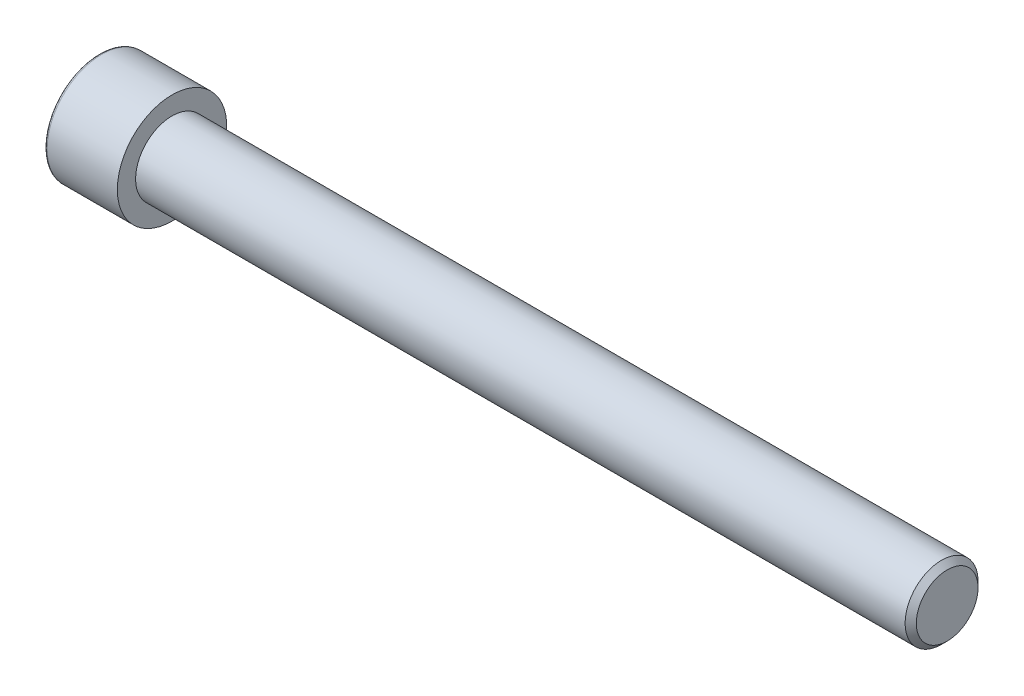
ISO-10303-21;
HEADER;
FILE_DESCRIPTION(('STEP AP214'),'2;1');
FILE_NAME('part.step','',(''),(''),'','','');
FILE_SCHEMA(('AUTOMOTIVE_DESIGN { 1 0 10303 214 1 1 1 1 }'));
ENDSEC;
DATA;
#1=APPLICATION_CONTEXT('core data for automotive mechanical design processes');
#2=APPLICATION_PROTOCOL_DEFINITION('international standard','automotive_design',2000,#1);
#3=PRODUCT_CONTEXT('',#1,'mechanical');
#4=PRODUCT('Part','Part','',(#3));
#5=PRODUCT_RELATED_PRODUCT_CATEGORY('part','',(#4));
#6=PRODUCT_DEFINITION_FORMATION('','',#4);
#7=PRODUCT_DEFINITION_CONTEXT('part definition',#1,'design');
#8=PRODUCT_DEFINITION('design','',#6,#7);
#9=PRODUCT_DEFINITION_SHAPE('','',#8);
#10=(LENGTH_UNIT() NAMED_UNIT(*) SI_UNIT(.MILLI.,.METRE.));
#11=(NAMED_UNIT(*) PLANE_ANGLE_UNIT() SI_UNIT($,.RADIAN.));
#12=(NAMED_UNIT(*) SI_UNIT($,.STERADIAN.) SOLID_ANGLE_UNIT());
#13=UNCERTAINTY_MEASURE_WITH_UNIT(LENGTH_MEASURE(1.E-05),#10,'distance_accuracy_value','');
#14=(GEOMETRIC_REPRESENTATION_CONTEXT(3) GLOBAL_UNCERTAINTY_ASSIGNED_CONTEXT((#13)) GLOBAL_UNIT_ASSIGNED_CONTEXT((#10,
#11,#12)) REPRESENTATION_CONTEXT('',''));
#15=CARTESIAN_POINT('',(0.,0.,0.));
#16=DIRECTION('',(0.,0.,1.));
#17=DIRECTION('',(1.,0.,0.));
#18=AXIS2_PLACEMENT_3D('',#15,#16,#17);
#19=CARTESIAN_POINT('',(0.,0.,0.));
#20=DIRECTION('',(1.,0.,0.));
#21=DIRECTION('',(0.,0.,-1.));
#22=AXIS2_PLACEMENT_3D('',#19,#20,#21);
#23=PLANE('',#22);
#24=DIRECTION('',(0.,-0.5,0.866025403784439));
#25=VECTOR('',#24,1.);
#26=CARTESIAN_POINT('',(0.,8.08290376865476,0.));
#27=LINE('',#26,#25);
#28=CARTESIAN_POINT('',(0.,8.08290376865476,0.));
#29=VERTEX_POINT('',#28);
#30=CARTESIAN_POINT('',(0.,4.04145188432738,7.));
#31=VERTEX_POINT('',#30);
#32=EDGE_CURVE('E100',#29,#31,#27,.T.);
#33=ORIENTED_EDGE('',*,*,#32,.T.);
#34=DIRECTION('',(0.,-1.,0.));
#35=VECTOR('',#34,1.);
#36=CARTESIAN_POINT('',(0.,4.04145188432738,7.));
#37=LINE('',#36,#35);
#38=CARTESIAN_POINT('',(0.,-4.04145188432738,7.));
#39=VERTEX_POINT('',#38);
#40=EDGE_CURVE('E107',#31,#39,#37,.T.);
#41=ORIENTED_EDGE('',*,*,#40,.T.);
#42=DIRECTION('',(0.,-0.5,-0.866025403784439));
#43=VECTOR('',#42,1.);
#44=CARTESIAN_POINT('',(0.,-4.04145188432738,7.));
#45=LINE('',#44,#43);
#46=CARTESIAN_POINT('',(0.,-8.08290376865476,0.));
#47=VERTEX_POINT('',#46);
#48=EDGE_CURVE('E113',#39,#47,#45,.T.);
#49=ORIENTED_EDGE('',*,*,#48,.T.);
#50=DIRECTION('',(0.,0.5,-0.866025403784439));
#51=VECTOR('',#50,1.);
#52=CARTESIAN_POINT('',(0.,-8.08290376865476,0.));
#53=LINE('',#52,#51);
#54=CARTESIAN_POINT('',(0.,-4.04145188432738,-7.));
#55=VERTEX_POINT('',#54);
#56=EDGE_CURVE('E122',#47,#55,#53,.T.);
#57=ORIENTED_EDGE('',*,*,#56,.T.);
#58=DIRECTION('',(0.,1.,0.));
#59=VECTOR('',#58,1.);
#60=CARTESIAN_POINT('',(0.,-4.04145188432738,-7.));
#61=LINE('',#60,#59);
#62=CARTESIAN_POINT('',(0.,4.04145188432738,-7.));
#63=VERTEX_POINT('',#62);
#64=EDGE_CURVE('E125',#55,#63,#61,.T.);
#65=ORIENTED_EDGE('',*,*,#64,.T.);
#66=DIRECTION('',(0.,0.5,0.866025403784439));
#67=VECTOR('',#66,1.);
#68=CARTESIAN_POINT('',(0.,4.04145188432738,-7.));
#69=LINE('',#68,#67);
#70=EDGE_CURVE('E118',#63,#29,#69,.T.);
#71=ORIENTED_EDGE('',*,*,#70,.T.);
#72=EDGE_LOOP('',(#33,#41,#49,#57,#65,#71));
#73=FACE_BOUND('',#72,.T.);
#74=CARTESIAN_POINT('',(0.,0.,0.));
#75=DIRECTION('',(-1.,0.,0.));
#76=DIRECTION('',(0.,0.,1.));
#77=AXIS2_PLACEMENT_3D('',#74,#75,#76);
#78=CIRCLE('',#77,11.4);
#79=CARTESIAN_POINT('',(0.,0.,11.4));
#80=VERTEX_POINT('',#79);
#81=EDGE_CURVE('E142',#80,#80,#78,.T.);
#82=ORIENTED_EDGE('',*,*,#81,.T.);
#83=EDGE_LOOP('',(#82));
#84=FACE_BOUND('',#83,.T.);
#85=ADVANCED_FACE('F39',(#73,#84),#23,.F.);
#86=CARTESIAN_POINT('',(16.,12.,0.));
#87=DIRECTION('',(-1.,0.,0.));
#88=DIRECTION('',(0.,0.,1.));
#89=AXIS2_PLACEMENT_3D('',#86,#87,#88);
#90=PLANE('',#89);
#91=CARTESIAN_POINT('',(16.,0.,0.));
#92=DIRECTION('',(-1.,0.,0.));
#93=DIRECTION('',(0.,0.,1.));
#94=AXIS2_PLACEMENT_3D('',#91,#92,#93);
#95=CIRCLE('',#94,12.);
#96=CARTESIAN_POINT('',(16.,0.,12.));
#97=VERTEX_POINT('',#96);
#98=EDGE_CURVE('E148',#97,#97,#95,.T.);
#99=ORIENTED_EDGE('',*,*,#98,.F.);
#100=EDGE_LOOP('',(#99));
#101=FACE_BOUND('',#100,.T.);
#102=CARTESIAN_POINT('',(16.,0.,0.));
#103=DIRECTION('',(-1.,0.,0.));
#104=DIRECTION('',(0.,0.,1.));
#105=AXIS2_PLACEMENT_3D('',#102,#103,#104);
#106=CIRCLE('',#105,8.);
#107=CARTESIAN_POINT('',(16.,0.,8.));
#108=VERTEX_POINT('',#107);
#109=EDGE_CURVE('E151',#108,#108,#106,.F.);
#110=ORIENTED_EDGE('',*,*,#109,.F.);
#111=EDGE_LOOP('',(#110));
#112=FACE_BOUND('',#111,.T.);
#113=ADVANCED_FACE('F210',(#101,#112),#90,.F.);
#114=CARTESIAN_POINT('',(16.,0.,0.));
#115=DIRECTION('',(-1.,0.,0.));
#116=DIRECTION('',(0.,0.,1.));
#117=AXIS2_PLACEMENT_3D('',#114,#115,#116);
#118=CYLINDRICAL_SURFACE('',#117,12.);
#119=CARTESIAN_POINT('',(0.6,0.,0.));
#120=DIRECTION('',(-1.,0.,0.));
#121=DIRECTION('',(0.,0.,1.));
#122=AXIS2_PLACEMENT_3D('',#119,#120,#121);
#123=CIRCLE('',#122,12.);
#124=CARTESIAN_POINT('',(0.6,0.,12.));
#125=VERTEX_POINT('',#124);
#126=EDGE_CURVE('E145',#125,#125,#123,.T.);
#127=ORIENTED_EDGE('',*,*,#126,.F.);
#128=EDGE_LOOP('',(#127));
#129=FACE_BOUND('',#128,.T.);
#130=ORIENTED_EDGE('',*,*,#98,.T.);
#131=EDGE_LOOP('',(#130));
#132=FACE_BOUND('',#131,.T.);
#133=ADVANCED_FACE('F214',(#129,#132),#118,.T.);
#134=CARTESIAN_POINT('',(0.600000000000005,0.,0.));
#135=DIRECTION('',(-1.,0.,0.));
#136=DIRECTION('',(0.,0.,1.));
#137=AXIS2_PLACEMENT_3D('',#134,#135,#136);
#138=TOROIDAL_SURFACE('',#137,11.4,0.600000000000009);
#139=ORIENTED_EDGE('',*,*,#126,.T.);
#140=EDGE_LOOP('',(#139));
#141=FACE_BOUND('',#140,.T.);
#142=ORIENTED_EDGE('',*,*,#81,.F.);
#143=EDGE_LOOP('',(#142));
#144=FACE_BOUND('',#143,.T.);
#145=ADVANCED_FACE('F220',(#141,#144),#138,.T.);
#146=CARTESIAN_POINT('',(186.,0.,0.));
#147=DIRECTION('',(-1.,0.,0.));
#148=DIRECTION('',(0.,0.,1.));
#149=AXIS2_PLACEMENT_3D('',#146,#147,#148);
#150=CYLINDRICAL_SURFACE('',#149,8.);
#151=ORIENTED_EDGE('',*,*,#109,.T.);
#152=EDGE_LOOP('',(#151));
#153=FACE_BOUND('',#152,.T.);
#154=CARTESIAN_POINT('',(184.773,0.,0.));
#155=DIRECTION('',(-1.,0.,0.));
#156=DIRECTION('',(0.,0.,1.));
#157=AXIS2_PLACEMENT_3D('',#154,#155,#156);
#158=CIRCLE('',#157,8.);
#159=CARTESIAN_POINT('',(184.773,0.,8.));
#160=VERTEX_POINT('',#159);
#161=EDGE_CURVE('E139',#160,#160,#158,.T.);
#162=ORIENTED_EDGE('',*,*,#161,.T.);
#163=EDGE_LOOP('',(#162));
#164=FACE_BOUND('',#163,.T.);
#165=ADVANCED_FACE('F227',(#153,#164),#150,.T.);
#166=CARTESIAN_POINT('',(186.,0.,0.));
#167=DIRECTION('',(-1.,0.,0.));
#168=DIRECTION('',(0.,0.,1.));
#169=AXIS2_PLACEMENT_3D('',#166,#167,#168);
#170=CONICAL_SURFACE('',#169,6.773,0.785398163397446);
#171=ORIENTED_EDGE('',*,*,#161,.F.);
#172=EDGE_LOOP('',(#171));
#173=FACE_BOUND('',#172,.T.);
#174=CARTESIAN_POINT('',(186.,0.,0.));
#175=DIRECTION('',(-1.,0.,0.));
#176=DIRECTION('',(0.,0.,1.));
#177=AXIS2_PLACEMENT_3D('',#174,#175,#176);
#178=CIRCLE('',#177,6.773);
#179=CARTESIAN_POINT('',(186.,0.,6.773));
#180=VERTEX_POINT('',#179);
#181=EDGE_CURVE('E103',#180,#180,#178,.T.);
#182=ORIENTED_EDGE('',*,*,#181,.T.);
#183=EDGE_LOOP('',(#182));
#184=FACE_BOUND('',#183,.T.);
#185=ADVANCED_FACE('F207',(#173,#184),#170,.T.);
#186=CARTESIAN_POINT('',(186.,6.773,0.));
#187=DIRECTION('',(-1.,0.,0.));
#188=DIRECTION('',(0.,0.,1.));
#189=AXIS2_PLACEMENT_3D('',#186,#187,#188);
#190=PLANE('',#189);
#191=ORIENTED_EDGE('',*,*,#181,.F.);
#192=EDGE_LOOP('',(#191));
#193=FACE_BOUND('',#192,.T.);
#194=ADVANCED_FACE('F203',(#193),#190,.F.);
#195=CARTESIAN_POINT('',(12.,8.08290376865476,0.));
#196=DIRECTION('',(0.,-0.866025403784439,-0.5));
#197=DIRECTION('',(0.,0.5,-0.866025403784439));
#198=AXIS2_PLACEMENT_3D('',#195,#196,#197);
#199=PLANE('',#198);
#200=DIRECTION('',(-1.,0.,0.));
#201=VECTOR('',#200,1.);
#202=CARTESIAN_POINT('',(12.,8.08290376865476,0.));
#203=LINE('',#202,#201);
#204=CARTESIAN_POINT('',(8.24081062144515,8.08290376865476,0.));
#205=VERTEX_POINT('',#204);
#206=EDGE_CURVE('E128',#205,#29,#203,.T.);
#207=ORIENTED_EDGE('',*,*,#206,.F.);
#208=CARTESIAN_POINT('',(8.24074395334994,8.0830192387086,-0.000200000000000299));
#209=CARTESIAN_POINT('',(8.29202555673095,7.99418356332252,0.153667903293391));
#210=CARTESIAN_POINT('',(8.34097980978085,7.90501666556988,0.30810950055425));
#211=CARTESIAN_POINT('',(8.4335926165143,7.72595873929905,0.618246926353254));
#212=CARTESIAN_POINT('',(8.47724888570507,7.63606741609896,0.773943265295415));
#213=CARTESIAN_POINT('',(8.59941381160494,7.36495417725225,1.24352516958246));
#214=CARTESIAN_POINT('',(8.66889984688949,7.18266208641081,1.5592643327378));
#215=CARTESIAN_POINT('',(8.75038044738534,6.9098652897096,2.03176224476633));
#216=CARTESIAN_POINT('',(8.77359191890296,6.82017566928259,2.18710922425749));
#217=CARTESIAN_POINT('',(8.81251418935198,6.64039116946081,2.49850511236216));
#218=CARTESIAN_POINT('',(8.82822565100491,6.55029632658303,2.65455395772641));
#219=CARTESIAN_POINT('',(8.85174749050138,6.36995016641051,2.96692267009517));
#220=CARTESIAN_POINT('',(8.85956683512157,6.27969914366237,3.12324202693001));
#221=CARTESIAN_POINT('',(8.86714516201213,6.09911871281642,3.43601650800788));
#222=CARTESIAN_POINT('',(8.86690439329045,6.00878930722637,3.59247162790734));
#223=CARTESIAN_POINT('',(8.85516567196884,5.76131663355911,4.02110687218394));
#224=CARTESIAN_POINT('',(8.83545966104152,5.60425437562033,4.2931466828854));
#225=CARTESIAN_POINT('',(8.77297194365867,5.29117305327856,4.8354194400822));
#226=CARTESIAN_POINT('',(8.73016887967145,5.13515508991674,5.10565047951828));
#227=CARTESIAN_POINT('',(8.62317372407408,4.82144370220969,5.64901454193984));
#228=CARTESIAN_POINT('',(8.55852830921477,4.66378986193159,5.92207900330984));
#229=CARTESIAN_POINT('',(8.4118093319374,4.35083323311213,6.46413578499063));
#230=CARTESIAN_POINT('',(8.32977023275887,4.19552643669177,6.73313504715144));
#231=CARTESIAN_POINT('',(8.24074395334994,4.04133641427354,7.0002));
#232=B_SPLINE_CURVE_WITH_KNOTS('',3,(#208,#209,#210,#211,#212,#213,#214,#215,#216,#217,#218,
#219,#220,#221,#222,#223,#224,#225,#226,#227,#228,#229,#230,#231),.UNSPECIFIED.,.F.,.F.,(4,2,2,
2,2,2,2,2,2,2,2,4),(0.,0.554727910214695,1.10969417576209,2.2219327402719,2.76443041023617,
3.30688013473357,3.8487128486711,4.39052882332379,5.33376515141419,6.27787517570456,
7.2429241888324,8.20607866430097),.UNSPECIFIED.);
#233=CARTESIAN_POINT('',(8.24081062144515,4.04145188432738,7.));
#234=VERTEX_POINT('',#233);
#235=EDGE_CURVE('E11',#205,#234,#232,.T.);
#236=ORIENTED_EDGE('',*,*,#235,.T.);
#237=DIRECTION('',(-1.,0.,0.));
#238=VECTOR('',#237,1.);
#239=CARTESIAN_POINT('',(12.,4.04145188432738,7.));
#240=LINE('',#239,#238);
#241=EDGE_CURVE('E95',#234,#31,#240,.T.);
#242=ORIENTED_EDGE('',*,*,#241,.T.);
#243=ORIENTED_EDGE('',*,*,#32,.F.);
#244=EDGE_LOOP('',(#207,#236,#242,#243));
#245=FACE_BOUND('',#244,.T.);
#246=ADVANCED_FACE('F98',(#245),#199,.T.);
#247=CARTESIAN_POINT('',(12.,4.04145188432738,7.));
#248=DIRECTION('',(0.,0.,-1.));
#249=DIRECTION('',(-1.,0.,0.));
#250=AXIS2_PLACEMENT_3D('',#247,#248,#249);
#251=PLANE('',#250);
#252=ORIENTED_EDGE('',*,*,#241,.F.);
#253=CARTESIAN_POINT('',(5.57587941292219,-10.5951395559688,7.));
#254=CARTESIAN_POINT('',(5.72215788472476,-10.2913873854027,7.));
#255=CARTESIAN_POINT('',(5.86695568880045,-9.98690898111586,7.));
#256=CARTESIAN_POINT('',(6.15275105757623,-9.37611217415566,7.));
#257=CARTESIAN_POINT('',(6.29374796487649,-9.06979346424692,7.));
#258=CARTESIAN_POINT('',(6.57186848515588,-8.45322208251383,7.));
#259=CARTESIAN_POINT('',(6.70896439043919,-8.14295686634533,7.));
#260=CARTESIAN_POINT('',(6.97718199770579,-7.51986421385499,7.));
#261=CARTESIAN_POINT('',(7.10830400201994,-7.20703690814435,7.));
#262=CARTESIAN_POINT('',(7.36656028504088,-6.5695005443991,7.));
#263=CARTESIAN_POINT('',(7.49348005127018,-6.24470408202464,7.));
#264=CARTESIAN_POINT('',(7.73706702336103,-5.59121778689269,7.));
#265=CARTESIAN_POINT('',(7.85373304467385,-5.26252750927219,7.));
#266=CARTESIAN_POINT('',(8.07355811047227,-4.60143032919695,7.));
#267=CARTESIAN_POINT('',(8.17674688296708,-4.2690334243111,7.));
#268=CARTESIAN_POINT('',(8.36613945739777,-3.59949554460914,7.));
#269=CARTESIAN_POINT('',(8.45234888881718,-3.2623561820045,7.));
#270=CARTESIAN_POINT('',(8.60305564581958,-2.58479315996282,7.));
#271=CARTESIAN_POINT('',(8.66765350449936,-2.24439250484352,7.));
#272=CARTESIAN_POINT('',(8.74539831642546,-1.73091216973467,7.));
#273=CARTESIAN_POINT('',(8.7681223476882,-1.55925781299778,7.));
#274=CARTESIAN_POINT('',(8.80673620890492,-1.21518758086266,7.));
#275=CARTESIAN_POINT('',(8.82262668929935,-1.04277177952026,7.));
#276=CARTESIAN_POINT('',(8.84707027467927,-0.699545376197852,7.));
#277=CARTESIAN_POINT('',(8.85571101390069,-0.528741034985779,7.));
#278=CARTESIAN_POINT('',(8.86578587656476,-0.1869208499621,7.));
#279=CARTESIAN_POINT('',(8.86722011156257,-0.0159050094654492,7.));
#280=CARTESIAN_POINT('',(8.86284767868586,0.326038893609979,7.));
#281=CARTESIAN_POINT('',(8.85704082162707,0.496966953778641,7.));
#282=CARTESIAN_POINT('',(8.8383221933219,0.838436119348584,7.));
#283=CARTESIAN_POINT('',(8.82541002346138,1.00897720250108,7.));
#284=CARTESIAN_POINT('',(8.78532318764043,1.42691016284093,7.));
#285=CARTESIAN_POINT('',(8.75433158385114,1.67394276264429,7.));
#286=CARTESIAN_POINT('',(8.67919370737725,2.1659883041221,7.));
#287=CARTESIAN_POINT('',(8.63504542432949,2.41100093125723,7.));
#288=CARTESIAN_POINT('',(8.48522311454851,3.14282333035987,7.));
#289=CARTESIAN_POINT('',(8.36220388516809,3.62611875071593,7.));
#290=CARTESIAN_POINT('',(8.15116787960062,4.3487805325071,7.));
#291=CARTESIAN_POINT('',(8.07542139419739,4.59194251167669,7.));
#292=CARTESIAN_POINT('',(7.9166482621531,5.07590132488677,7.));
#293=CARTESIAN_POINT('',(7.83362156396132,5.31669814216627,7.));
#294=CARTESIAN_POINT('',(7.66157133885048,5.79601723780591,7.));
#295=CARTESIAN_POINT('',(7.5725500954382,6.03454034320772,7.));
#296=CARTESIAN_POINT('',(7.3894995127239,6.50964710521445,7.));
#297=CARTESIAN_POINT('',(7.29547025517154,6.74623079340525,7.));
#298=CARTESIAN_POINT('',(7.05091022334063,7.34607004782587,7.));
#299=CARTESIAN_POINT('',(6.89749500530549,7.70814802994476,7.));
#300=CARTESIAN_POINT('',(6.58311405374231,8.42902142446664,7.));
#301=CARTESIAN_POINT('',(6.4221477486436,8.78781658591592,7.));
#302=CARTESIAN_POINT('',(6.09434206590049,9.5028229612945,7.));
#303=CARTESIAN_POINT('',(5.92750112189063,9.85903345506375,7.));
#304=CARTESIAN_POINT('',(5.58925640841321,10.5692634953458,7.));
#305=CARTESIAN_POINT('',(5.41785276367774,10.9232831014262,7.));
#306=CARTESIAN_POINT('',(5.07120500870259,11.6299725078319,7.));
#307=CARTESIAN_POINT('',(4.8959564472764,11.982640120912,7.));
#308=CARTESIAN_POINT('',(4.54252537077448,12.6865021421779,7.));
#309=CARTESIAN_POINT('',(4.3643428393958,13.0376965421641,7.));
#310=CARTESIAN_POINT('',(3.82629497051468,14.0893490285881,7.));
#311=CARTESIAN_POINT('',(3.46287434288011,14.7879876175435,7.));
#312=CARTESIAN_POINT('',(2.76400520764348,16.1163630798682,7.));
#313=CARTESIAN_POINT('',(2.42913665633273,16.7464064050781,7.));
#314=CARTESIAN_POINT('',(1.75544455886196,18.0044087683408,7.));
#315=CARTESIAN_POINT('',(1.4166208425721,18.6323677152318,7.));
#316=CARTESIAN_POINT('',(0.736900591610472,19.8850342571872,7.));
#317=CARTESIAN_POINT('',(0.396011800685717,20.5097460603558,7.));
#318=CARTESIAN_POINT('',(-0.288064689435112,21.7578620874728,7.));
#319=CARTESIAN_POINT('',(-0.631252251240716,22.3812663866935,7.));
#320=CARTESIAN_POINT('',(-0.975285006989568,23.0042010690845,7.));
#321=B_SPLINE_CURVE_WITH_KNOTS('',3,(#253,#254,#255,#256,#257,#258,#259,#260,#261,#262,#263,
#264,#265,#266,#267,#268,#269,#270,#271,#272,#273,#274,#275,#276,#277,#278,#279,#280,#281,#282,
#283,#284,#285,#286,#287,#288,#289,#290,#291,#292,#293,#294,#295,#296,#297,#298,#299,#300,#301,
#302,#303,#304,#305,#306,#307,#308,#309,#310,#311,#312,#313,#314,#315,#316,#317,#318,#319,#320),
.UNSPECIFIED.,.F.,.F.,(4,2,2,2,2,2,2,2,2,2,2,2,2,2,2,2,2,2,2,2,2,2,2,2,2,2,2,2,2,2,2,2,2,4),(0.,
1.01143101724814,2.02303586270392,3.04059952013218,4.0581116227373,5.10411913857804,
6.15024733449321,7.19402754905384,8.23746111460828,9.27597104351024,9.79531214242649,
10.3146037977555,10.8275239688931,11.3404362001106,11.8533618322016,12.3663162427945,
13.1127965817182,13.8593910426537,15.3534778065278,16.1174816538324,16.8814909114363,
17.6452107630153,18.4089181516302,19.5885110371782,20.7681933551521,21.9481926318707,
23.1281596836154,24.3095735159024,25.4909939150696,27.8534625107793,29.9939673638473,
32.1345646316569,34.269560689375,36.4044302636885),.UNSPECIFIED.);
#322=CARTESIAN_POINT('',(8.24081062144515,-4.04145188432738,7.));
#323=VERTEX_POINT('',#322);
#324=EDGE_CURVE('E51',#234,#323,#321,.F.);
#325=ORIENTED_EDGE('',*,*,#324,.T.);
#326=DIRECTION('',(-1.,0.,0.));
#327=VECTOR('',#326,1.);
#328=CARTESIAN_POINT('',(12.,-4.04145188432738,7.));
#329=LINE('',#328,#327);
#330=EDGE_CURVE('E104',#323,#39,#329,.T.);
#331=ORIENTED_EDGE('',*,*,#330,.T.);
#332=ORIENTED_EDGE('',*,*,#40,.F.);
#333=EDGE_LOOP('',(#252,#325,#331,#332));
#334=FACE_BOUND('',#333,.T.);
#335=ADVANCED_FACE('F108',(#334),#251,.T.);
#336=CARTESIAN_POINT('',(12.,-4.04145188432738,7.));
#337=DIRECTION('',(0.,0.866025403784439,-0.5));
#338=DIRECTION('',(0.,0.5,0.866025403784439));
#339=AXIS2_PLACEMENT_3D('',#336,#337,#338);
#340=PLANE('',#339);
#341=ORIENTED_EDGE('',*,*,#330,.F.);
#342=CARTESIAN_POINT('',(8.24074395334994,-4.04133641427354,7.0002));
#343=CARTESIAN_POINT('',(8.29202555673095,-4.13017208965963,6.84633209670661));
#344=CARTESIAN_POINT('',(8.34097980978085,-4.21933898741226,6.69189049944575));
#345=CARTESIAN_POINT('',(8.4335926165143,-4.39839691368309,6.38175307364674));
#346=CARTESIAN_POINT('',(8.47724888570507,-4.48828823688319,6.22605673470458));
#347=CARTESIAN_POINT('',(8.59941381160494,-4.75940147572989,5.75647483041753));
#348=CARTESIAN_POINT('',(8.66889984688949,-4.94169356657133,5.4407356672622));
#349=CARTESIAN_POINT('',(8.75038044738534,-5.21449036327254,4.96823775523367));
#350=CARTESIAN_POINT('',(8.77359191890296,-5.30417998369956,4.81289077574251));
#351=CARTESIAN_POINT('',(8.81251418935198,-5.48396448352133,4.50149488763783));
#352=CARTESIAN_POINT('',(8.82822565100491,-5.57405932639911,4.34544604227359));
#353=CARTESIAN_POINT('',(8.85174749050138,-5.75440548657163,4.03307732990482));
#354=CARTESIAN_POINT('',(8.85956683512157,-5.84465650931978,3.87675797306999));
#355=CARTESIAN_POINT('',(8.86714516201213,-6.02523694016573,3.56398349199212));
#356=CARTESIAN_POINT('',(8.86690439329045,-6.11556634575578,3.40752837209266));
#357=CARTESIAN_POINT('',(8.85516567196884,-6.36303901942303,2.97889312781606));
#358=CARTESIAN_POINT('',(8.83545966104152,-6.52010127736182,2.7068533171146));
#359=CARTESIAN_POINT('',(8.77297194365867,-6.83318259970359,2.1645805599178));
#360=CARTESIAN_POINT('',(8.73016887967145,-6.9892005630654,1.89434952048172));
#361=CARTESIAN_POINT('',(8.62317372407408,-7.30291195077246,1.35098545806016));
#362=CARTESIAN_POINT('',(8.55852830921477,-7.46056579105055,1.07792099669016));
#363=CARTESIAN_POINT('',(8.4118093319374,-7.77352241987001,0.53586421500937));
#364=CARTESIAN_POINT('',(8.32977023275887,-7.92882921629037,0.266864952848559));
#365=CARTESIAN_POINT('',(8.24074395334994,-8.0830192387086,-0.000200000000000452));
#366=B_SPLINE_CURVE_WITH_KNOTS('',3,(#342,#343,#344,#345,#346,#347,#348,#349,#350,#351,#352,
#353,#354,#355,#356,#357,#358,#359,#360,#361,#362,#363,#364,#365),.UNSPECIFIED.,.F.,.F.,(4,2,2,
2,2,2,2,2,2,2,2,4),(0.,0.554727910214695,1.10969417576209,2.2219327402719,2.76443041023617,
3.30688013473358,3.8487128486711,4.39052882332379,5.33376515141419,6.27787517570456,
7.2429241888324,8.20607866430097),.UNSPECIFIED.);
#367=CARTESIAN_POINT('',(8.24081062144515,-8.08290376865476,0.));
#368=VERTEX_POINT('',#367);
#369=EDGE_CURVE('E61',#323,#368,#366,.T.);
#370=ORIENTED_EDGE('',*,*,#369,.T.);
#371=DIRECTION('',(-1.,0.,0.));
#372=VECTOR('',#371,1.);
#373=CARTESIAN_POINT('',(12.,-8.08290376865476,0.));
#374=LINE('',#373,#372);
#375=EDGE_CURVE('E134',#368,#47,#374,.T.);
#376=ORIENTED_EDGE('',*,*,#375,.T.);
#377=ORIENTED_EDGE('',*,*,#48,.F.);
#378=EDGE_LOOP('',(#341,#370,#376,#377));
#379=FACE_BOUND('',#378,.T.);
#380=ADVANCED_FACE('F183',(#379),#340,.T.);
#381=CARTESIAN_POINT('',(12.,-8.08290376865476,0.));
#382=DIRECTION('',(0.,0.866025403784439,0.5));
#383=DIRECTION('',(0.,-0.5,0.866025403784439));
#384=AXIS2_PLACEMENT_3D('',#381,#382,#383);
#385=PLANE('',#384);
#386=ORIENTED_EDGE('',*,*,#375,.F.);
#387=CARTESIAN_POINT('',(8.24074395334994,-8.0830192387086,0.000200000000000299));
#388=CARTESIAN_POINT('',(8.29202555673095,-7.99418356332252,-0.153667903293391));
#389=CARTESIAN_POINT('',(8.34097980978085,-7.90501666556988,-0.30810950055425));
#390=CARTESIAN_POINT('',(8.4335926165143,-7.72595873929905,-0.618246926353254));
#391=CARTESIAN_POINT('',(8.47724888570507,-7.63606741609896,-0.773943265295415));
#392=CARTESIAN_POINT('',(8.59941381160494,-7.36495417725225,-1.24352516958246));
#393=CARTESIAN_POINT('',(8.66889984688949,-7.18266208641081,-1.5592643327378));
#394=CARTESIAN_POINT('',(8.75038044738534,-6.9098652897096,-2.03176224476633));
#395=CARTESIAN_POINT('',(8.77359191890296,-6.82017566928259,-2.18710922425749));
#396=CARTESIAN_POINT('',(8.81251418935198,-6.64039116946081,-2.49850511236216));
#397=CARTESIAN_POINT('',(8.82822565100491,-6.55029632658303,-2.65455395772641));
#398=CARTESIAN_POINT('',(8.85174749050138,-6.36995016641051,-2.96692267009517));
#399=CARTESIAN_POINT('',(8.85956683512157,-6.27969914366237,-3.12324202693001));
#400=CARTESIAN_POINT('',(8.86714516201213,-6.09911871281642,-3.43601650800788));
#401=CARTESIAN_POINT('',(8.86690439329045,-6.00878930722637,-3.59247162790734));
#402=CARTESIAN_POINT('',(8.85516567196884,-5.76131663355911,-4.02110687218394));
#403=CARTESIAN_POINT('',(8.83545966104152,-5.60425437562033,-4.2931466828854));
#404=CARTESIAN_POINT('',(8.77297194365867,-5.29117305327856,-4.8354194400822));
#405=CARTESIAN_POINT('',(8.73016887967145,-5.13515508991674,-5.10565047951828));
#406=CARTESIAN_POINT('',(8.62317372407408,-4.82144370220969,-5.64901454193984));
#407=CARTESIAN_POINT('',(8.55852830921477,-4.66378986193159,-5.92207900330984));
#408=CARTESIAN_POINT('',(8.4118093319374,-4.35083323311213,-6.46413578499063));
#409=CARTESIAN_POINT('',(8.32977023275887,-4.19552643669177,-6.73313504715144));
#410=CARTESIAN_POINT('',(8.24074395334994,-4.04133641427354,-7.0002));
#411=B_SPLINE_CURVE_WITH_KNOTS('',3,(#387,#388,#389,#390,#391,#392,#393,#394,#395,#396,#397,
#398,#399,#400,#401,#402,#403,#404,#405,#406,#407,#408,#409,#410),.UNSPECIFIED.,.F.,.F.,(4,2,2,
2,2,2,2,2,2,2,2,4),(0.,0.554727910214695,1.10969417576209,2.2219327402719,2.76443041023617,
3.30688013473357,3.8487128486711,4.39052882332379,5.33376515141419,6.27787517570456,
7.2429241888324,8.20607866430097),.UNSPECIFIED.);
#412=CARTESIAN_POINT('',(8.24081062144515,-4.04145188432738,-7.));
#413=VERTEX_POINT('',#412);
#414=EDGE_CURVE('E187',#368,#413,#411,.T.);
#415=ORIENTED_EDGE('',*,*,#414,.T.);
#416=DIRECTION('',(-1.,0.,0.));
#417=VECTOR('',#416,1.);
#418=CARTESIAN_POINT('',(12.,-4.04145188432738,-7.));
#419=LINE('',#418,#417);
#420=EDGE_CURVE('E132',#413,#55,#419,.T.);
#421=ORIENTED_EDGE('',*,*,#420,.T.);
#422=ORIENTED_EDGE('',*,*,#56,.F.);
#423=EDGE_LOOP('',(#386,#415,#421,#422));
#424=FACE_BOUND('',#423,.T.);
#425=ADVANCED_FACE('F178',(#424),#385,.T.);
#426=CARTESIAN_POINT('',(12.,-4.04145188432738,-7.));
#427=DIRECTION('',(0.,0.,1.));
#428=DIRECTION('',(1.,0.,0.));
#429=AXIS2_PLACEMENT_3D('',#426,#427,#428);
#430=PLANE('',#429);
#431=ORIENTED_EDGE('',*,*,#420,.F.);
#432=CARTESIAN_POINT('',(5.57587941292219,-10.5951395559688,-7.));
#433=CARTESIAN_POINT('',(5.72215788472476,-10.2913873854027,-7.));
#434=CARTESIAN_POINT('',(5.86695568880045,-9.98690898111586,-7.));
#435=CARTESIAN_POINT('',(6.15275105757623,-9.37611217415566,-7.));
#436=CARTESIAN_POINT('',(6.29374796487649,-9.06979346424692,-7.));
#437=CARTESIAN_POINT('',(6.57186848515588,-8.45322208251383,-7.));
#438=CARTESIAN_POINT('',(6.70896439043919,-8.14295686634533,-7.));
#439=CARTESIAN_POINT('',(6.97718199770579,-7.51986421385499,-7.));
#440=CARTESIAN_POINT('',(7.10830400201994,-7.20703690814435,-7.));
#441=CARTESIAN_POINT('',(7.36656028504088,-6.5695005443991,-7.));
#442=CARTESIAN_POINT('',(7.49348005127018,-6.24470408202464,-7.));
#443=CARTESIAN_POINT('',(7.73706702336103,-5.59121778689269,-7.));
#444=CARTESIAN_POINT('',(7.85373304467385,-5.26252750927219,-7.));
#445=CARTESIAN_POINT('',(8.07355811047227,-4.60143032919695,-7.));
#446=CARTESIAN_POINT('',(8.17674688296708,-4.2690334243111,-7.));
#447=CARTESIAN_POINT('',(8.36613945739777,-3.59949554460914,-7.));
#448=CARTESIAN_POINT('',(8.45234888881718,-3.2623561820045,-7.));
#449=CARTESIAN_POINT('',(8.60305564581958,-2.58479315996282,-7.));
#450=CARTESIAN_POINT('',(8.66765350449936,-2.24439250484352,-7.));
#451=CARTESIAN_POINT('',(8.74539831642546,-1.73091216973467,-7.));
#452=CARTESIAN_POINT('',(8.7681223476882,-1.55925781299778,-7.));
#453=CARTESIAN_POINT('',(8.80673620890492,-1.21518758086266,-7.));
#454=CARTESIAN_POINT('',(8.82262668929935,-1.04277177952026,-7.));
#455=CARTESIAN_POINT('',(8.84707027467927,-0.699545376197852,-7.));
#456=CARTESIAN_POINT('',(8.85571101390069,-0.528741034985779,-7.));
#457=CARTESIAN_POINT('',(8.86578587656476,-0.1869208499621,-7.));
#458=CARTESIAN_POINT('',(8.86722011156257,-0.0159050094654492,-7.));
#459=CARTESIAN_POINT('',(8.86284767868586,0.326038893609979,-7.));
#460=CARTESIAN_POINT('',(8.85704082162707,0.496966953778641,-7.));
#461=CARTESIAN_POINT('',(8.8383221933219,0.838436119348584,-7.));
#462=CARTESIAN_POINT('',(8.82541002346138,1.00897720250108,-7.));
#463=CARTESIAN_POINT('',(8.78532318764043,1.42691016284093,-7.));
#464=CARTESIAN_POINT('',(8.75433158385114,1.67394276264429,-7.));
#465=CARTESIAN_POINT('',(8.67919370737725,2.1659883041221,-7.));
#466=CARTESIAN_POINT('',(8.63504542432949,2.41100093125723,-7.));
#467=CARTESIAN_POINT('',(8.48522311454851,3.14282333035987,-7.));
#468=CARTESIAN_POINT('',(8.36220388516809,3.62611875071593,-7.));
#469=CARTESIAN_POINT('',(8.15116787960062,4.3487805325071,-7.));
#470=CARTESIAN_POINT('',(8.07542139419739,4.59194251167669,-7.));
#471=CARTESIAN_POINT('',(7.9166482621531,5.07590132488677,-7.));
#472=CARTESIAN_POINT('',(7.83362156396132,5.31669814216627,-7.));
#473=CARTESIAN_POINT('',(7.66157133885048,5.79601723780591,-7.));
#474=CARTESIAN_POINT('',(7.5725500954382,6.03454034320772,-7.));
#475=CARTESIAN_POINT('',(7.3894995127239,6.50964710521445,-7.));
#476=CARTESIAN_POINT('',(7.29547025517154,6.74623079340525,-7.));
#477=CARTESIAN_POINT('',(7.05091022334063,7.34607004782587,-7.));
#478=CARTESIAN_POINT('',(6.89749500530549,7.70814802994476,-7.));
#479=CARTESIAN_POINT('',(6.58311405374231,8.42902142446664,-7.));
#480=CARTESIAN_POINT('',(6.4221477486436,8.78781658591592,-7.));
#481=CARTESIAN_POINT('',(6.09434206590049,9.5028229612945,-7.));
#482=CARTESIAN_POINT('',(5.92750112189063,9.85903345506375,-7.));
#483=CARTESIAN_POINT('',(5.58925640841321,10.5692634953458,-7.));
#484=CARTESIAN_POINT('',(5.41785276367774,10.9232831014262,-7.));
#485=CARTESIAN_POINT('',(5.07120500870259,11.6299725078319,-7.));
#486=CARTESIAN_POINT('',(4.8959564472764,11.982640120912,-7.));
#487=CARTESIAN_POINT('',(4.54252537077448,12.6865021421779,-7.));
#488=CARTESIAN_POINT('',(4.3643428393958,13.0376965421641,-7.));
#489=CARTESIAN_POINT('',(3.82629497051468,14.0893490285881,-7.));
#490=CARTESIAN_POINT('',(3.46287434288011,14.7879876175435,-7.));
#491=CARTESIAN_POINT('',(2.76400520764348,16.1163630798682,-7.));
#492=CARTESIAN_POINT('',(2.42913665633273,16.7464064050781,-7.));
#493=CARTESIAN_POINT('',(1.75544455886196,18.0044087683408,-7.));
#494=CARTESIAN_POINT('',(1.4166208425721,18.6323677152318,-7.));
#495=CARTESIAN_POINT('',(0.736900591610472,19.8850342571872,-7.));
#496=CARTESIAN_POINT('',(0.396011800685717,20.5097460603558,-7.));
#497=CARTESIAN_POINT('',(-0.288064689435112,21.7578620874728,-7.));
#498=CARTESIAN_POINT('',(-0.631252251240716,22.3812663866935,-7.));
#499=CARTESIAN_POINT('',(-0.975285006989568,23.0042010690845,-7.));
#500=B_SPLINE_CURVE_WITH_KNOTS('',3,(#432,#433,#434,#435,#436,#437,#438,#439,#440,#441,#442,
#443,#444,#445,#446,#447,#448,#449,#450,#451,#452,#453,#454,#455,#456,#457,#458,#459,#460,#461,
#462,#463,#464,#465,#466,#467,#468,#469,#470,#471,#472,#473,#474,#475,#476,#477,#478,#479,#480,
#481,#482,#483,#484,#485,#486,#487,#488,#489,#490,#491,#492,#493,#494,#495,#496,#497,#498,#499),
.UNSPECIFIED.,.F.,.F.,(4,2,2,2,2,2,2,2,2,2,2,2,2,2,2,2,2,2,2,2,2,2,2,2,2,2,2,2,2,2,2,2,2,4),(0.,
1.01143101724814,2.02303586270392,3.04059952013218,4.0581116227373,5.10411913857804,
6.15024733449321,7.19402754905384,8.23746111460828,9.27597104351024,9.79531214242649,
10.3146037977555,10.8275239688931,11.3404362001106,11.8533618322016,12.3663162427945,
13.1127965817182,13.8593910426537,15.3534778065278,16.1174816538324,16.8814909114363,
17.6452107630153,18.4089181516302,19.5885110371782,20.7681933551521,21.9481926318707,
23.1281596836154,24.3095735159024,25.4909939150696,27.8534625107793,29.9939673638473,
32.1345646316569,34.269560689375,36.4044302636885),.UNSPECIFIED.);
#501=CARTESIAN_POINT('',(8.24081062144515,4.04145188432738,-7.));
#502=VERTEX_POINT('',#501);
#503=EDGE_CURVE('E161',#413,#502,#500,.T.);
#504=ORIENTED_EDGE('',*,*,#503,.T.);
#505=DIRECTION('',(-1.,0.,0.));
#506=VECTOR('',#505,1.);
#507=CARTESIAN_POINT('',(12.,4.04145188432738,-7.));
#508=LINE('',#507,#506);
#509=EDGE_CURVE('E130',#502,#63,#508,.T.);
#510=ORIENTED_EDGE('',*,*,#509,.T.);
#511=ORIENTED_EDGE('',*,*,#64,.F.);
#512=EDGE_LOOP('',(#431,#504,#510,#511));
#513=FACE_BOUND('',#512,.T.);
#514=ADVANCED_FACE('F173',(#513),#430,.T.);
#515=CARTESIAN_POINT('',(12.,4.04145188432738,-7.));
#516=DIRECTION('',(0.,-0.866025403784439,0.5));
#517=DIRECTION('',(0.,-0.5,-0.866025403784439));
#518=AXIS2_PLACEMENT_3D('',#515,#516,#517);
#519=PLANE('',#518);
#520=ORIENTED_EDGE('',*,*,#509,.F.);
#521=CARTESIAN_POINT('',(8.24074395334994,4.04133641427354,-7.0002));
#522=CARTESIAN_POINT('',(8.29202555673095,4.13017208965963,-6.84633209670661));
#523=CARTESIAN_POINT('',(8.34097980978085,4.21933898741226,-6.69189049944575));
#524=CARTESIAN_POINT('',(8.4335926165143,4.39839691368309,-6.38175307364674));
#525=CARTESIAN_POINT('',(8.47724888570507,4.48828823688319,-6.22605673470458));
#526=CARTESIAN_POINT('',(8.59941381160494,4.75940147572989,-5.75647483041753));
#527=CARTESIAN_POINT('',(8.66889984688949,4.94169356657133,-5.4407356672622));
#528=CARTESIAN_POINT('',(8.75038044738534,5.21449036327254,-4.96823775523367));
#529=CARTESIAN_POINT('',(8.77359191890296,5.30417998369956,-4.81289077574251));
#530=CARTESIAN_POINT('',(8.81251418935198,5.48396448352133,-4.50149488763783));
#531=CARTESIAN_POINT('',(8.82822565100491,5.57405932639911,-4.34544604227359));
#532=CARTESIAN_POINT('',(8.85174749050138,5.75440548657163,-4.03307732990482));
#533=CARTESIAN_POINT('',(8.85956683512157,5.84465650931978,-3.87675797306999));
#534=CARTESIAN_POINT('',(8.86714516201213,6.02523694016573,-3.56398349199212));
#535=CARTESIAN_POINT('',(8.86690439329045,6.11556634575578,-3.40752837209266));
#536=CARTESIAN_POINT('',(8.85516567196884,6.36303901942303,-2.97889312781606));
#537=CARTESIAN_POINT('',(8.83545966104152,6.52010127736182,-2.7068533171146));
#538=CARTESIAN_POINT('',(8.77297194365867,6.83318259970359,-2.1645805599178));
#539=CARTESIAN_POINT('',(8.73016887967145,6.9892005630654,-1.89434952048172));
#540=CARTESIAN_POINT('',(8.62317372407408,7.30291195077246,-1.35098545806016));
#541=CARTESIAN_POINT('',(8.55852830921477,7.46056579105055,-1.07792099669016));
#542=CARTESIAN_POINT('',(8.4118093319374,7.77352241987001,-0.53586421500937));
#543=CARTESIAN_POINT('',(8.32977023275887,7.92882921629037,-0.266864952848559));
#544=CARTESIAN_POINT('',(8.24074395334994,8.0830192387086,0.000200000000000452));
#545=B_SPLINE_CURVE_WITH_KNOTS('',3,(#521,#522,#523,#524,#525,#526,#527,#528,#529,#530,#531,
#532,#533,#534,#535,#536,#537,#538,#539,#540,#541,#542,#543,#544),.UNSPECIFIED.,.F.,.F.,(4,2,2,
2,2,2,2,2,2,2,2,4),(0.,0.554727910214695,1.10969417576209,2.2219327402719,2.76443041023617,
3.30688013473358,3.8487128486711,4.39052882332379,5.33376515141419,6.27787517570456,
7.2429241888324,8.20607866430097),.UNSPECIFIED.);
#546=EDGE_CURVE('E154',#502,#205,#545,.T.);
#547=ORIENTED_EDGE('',*,*,#546,.T.);
#548=ORIENTED_EDGE('',*,*,#206,.T.);
#549=ORIENTED_EDGE('',*,*,#70,.F.);
#550=EDGE_LOOP('',(#520,#547,#548,#549));
#551=FACE_BOUND('',#550,.T.);
#552=ADVANCED_FACE('F170',(#551),#519,.T.);
#553=CARTESIAN_POINT('',(12.9074772881118,0.,0.));
#554=DIRECTION('',(-1.,0.,0.));
#555=DIRECTION('',(0.,0.,1.));
#556=AXIS2_PLACEMENT_3D('',#553,#554,#555);
#557=CONICAL_SURFACE('',#556,0.,1.0471975511966);
#558=ORIENTED_EDGE('',*,*,#235,.F.);
#559=ORIENTED_EDGE('',*,*,#546,.F.);
#560=ORIENTED_EDGE('',*,*,#503,.F.);
#561=ORIENTED_EDGE('',*,*,#414,.F.);
#562=ORIENTED_EDGE('',*,*,#369,.F.);
#563=ORIENTED_EDGE('',*,*,#324,.F.);
#564=EDGE_LOOP('',(#558,#559,#560,#561,#562,#563));
#565=FACE_BOUND('',#564,.T.);
#566=CARTESIAN_POINT('',(12.9074772881118,0.,0.));
#567=VERTEX_POINT('',#566);
#568=VERTEX_LOOP('',#567);
#569=FACE_BOUND('',#568,.T.);
#570=ADVANCED_FACE('F167',(#565,#569),#557,.F.);
#571=CLOSED_SHELL('',(#85,#113,#133,#145,#165,#185,#194,#246,#335,#380,#425,#514,#552,#570));
#572=MANIFOLD_SOLID_BREP('B2',#571);
#573=ADVANCED_BREP_SHAPE_REPRESENTATION('',(#18,#572),#14);
#574=SHAPE_DEFINITION_REPRESENTATION(#9,#573);
ENDSEC;
END-ISO-10303-21;
